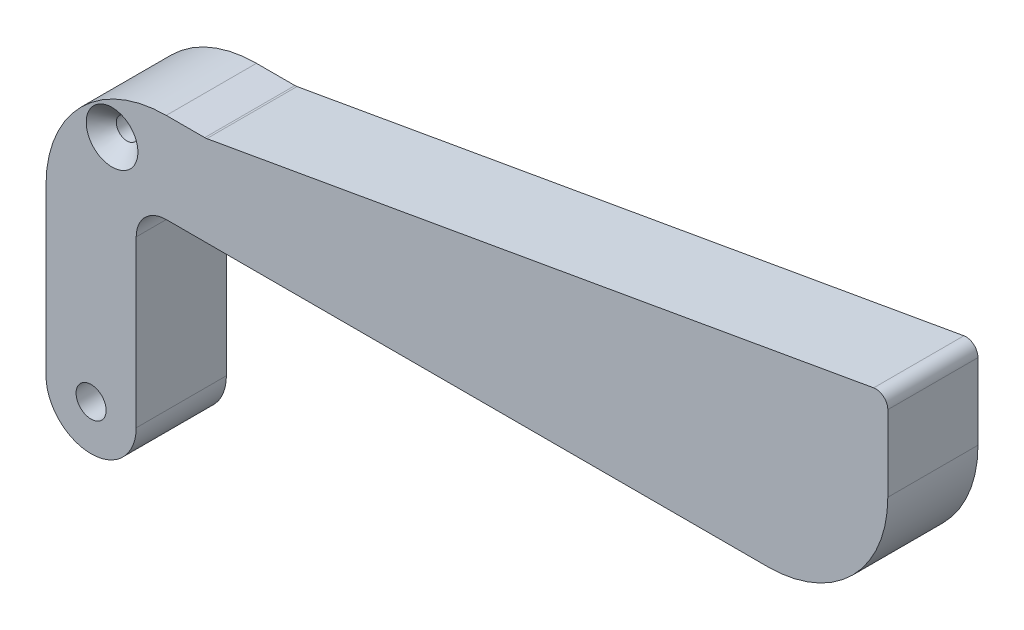
ISO-10303-21;
HEADER;
FILE_DESCRIPTION(('STEP AP214'),'2;1');
FILE_NAME('part.step','',(''),(''),'','','');
FILE_SCHEMA(('AUTOMOTIVE_DESIGN { 1 0 10303 214 1 1 1 1 }'));
ENDSEC;
DATA;
#1=APPLICATION_CONTEXT('core data for automotive mechanical design processes');
#2=APPLICATION_PROTOCOL_DEFINITION('international standard','automotive_design',2000,#1);
#3=PRODUCT_CONTEXT('',#1,'mechanical');
#4=PRODUCT('Part','Part','',(#3));
#5=PRODUCT_RELATED_PRODUCT_CATEGORY('part','',(#4));
#6=PRODUCT_DEFINITION_FORMATION('','',#4);
#7=PRODUCT_DEFINITION_CONTEXT('part definition',#1,'design');
#8=PRODUCT_DEFINITION('design','',#6,#7);
#9=PRODUCT_DEFINITION_SHAPE('','',#8);
#10=(LENGTH_UNIT() NAMED_UNIT(*) SI_UNIT(.MILLI.,.METRE.));
#11=(NAMED_UNIT(*) PLANE_ANGLE_UNIT() SI_UNIT($,.RADIAN.));
#12=(NAMED_UNIT(*) SI_UNIT($,.STERADIAN.) SOLID_ANGLE_UNIT());
#13=UNCERTAINTY_MEASURE_WITH_UNIT(LENGTH_MEASURE(1.E-05),#10,'distance_accuracy_value','');
#14=(GEOMETRIC_REPRESENTATION_CONTEXT(3) GLOBAL_UNCERTAINTY_ASSIGNED_CONTEXT((#13)) GLOBAL_UNIT_ASSIGNED_CONTEXT((#10,
#11,#12)) REPRESENTATION_CONTEXT('',''));
#15=CARTESIAN_POINT('',(0.,0.,0.));
#16=DIRECTION('',(0.,0.,1.));
#17=DIRECTION('',(1.,0.,0.));
#18=AXIS2_PLACEMENT_3D('',#15,#16,#17);
#19=CARTESIAN_POINT('',(0.,0.,19.05));
#20=DIRECTION('',(0.,1.,0.));
#21=DIRECTION('',(0.,0.,1.));
#22=AXIS2_PLACEMENT_3D('',#19,#20,#21);
#23=PLANE('',#22);
#24=DIRECTION('',(1.,0.,0.));
#25=VECTOR('',#24,1.);
#26=CARTESIAN_POINT('',(0.,0.,19.05));
#27=LINE('',#26,#25);
#28=CARTESIAN_POINT('',(25.4,0.,19.05));
#29=VERTEX_POINT('',#28);
#30=CARTESIAN_POINT('',(152.4,0.,19.05));
#31=VERTEX_POINT('',#30);
#32=EDGE_CURVE('E283',#29,#31,#27,.T.);
#33=ORIENTED_EDGE('',*,*,#32,.F.);
#34=DIRECTION('',(0.,0.,1.));
#35=VECTOR('',#34,1.);
#36=CARTESIAN_POINT('',(25.4,0.,0.));
#37=LINE('',#36,#35);
#38=CARTESIAN_POINT('',(25.4,0.,0.));
#39=VERTEX_POINT('',#38);
#40=EDGE_CURVE('E195',#29,#39,#37,.F.);
#41=ORIENTED_EDGE('',*,*,#40,.T.);
#42=DIRECTION('',(1.,0.,0.));
#43=VECTOR('',#42,1.);
#44=CARTESIAN_POINT('',(0.,0.,0.));
#45=LINE('',#44,#43);
#46=CARTESIAN_POINT('',(152.4,0.,0.));
#47=VERTEX_POINT('',#46);
#48=EDGE_CURVE('E157',#39,#47,#45,.T.);
#49=ORIENTED_EDGE('',*,*,#48,.T.);
#50=DIRECTION('',(0.,0.,-1.));
#51=VECTOR('',#50,1.);
#52=CARTESIAN_POINT('',(152.4,0.,19.05));
#53=LINE('',#52,#51);
#54=EDGE_CURVE('E178',#47,#31,#53,.F.);
#55=ORIENTED_EDGE('',*,*,#54,.T.);
#56=EDGE_LOOP('',(#33,#41,#49,#55));
#57=FACE_BOUND('',#56,.T.);
#58=ADVANCED_FACE('F33',(#57),#23,.F.);
#59=CARTESIAN_POINT('',(0.,0.,19.05));
#60=DIRECTION('',(1.,0.,0.));
#61=DIRECTION('',(0.,0.,-1.));
#62=AXIS2_PLACEMENT_3D('',#59,#60,#61);
#63=PLANE('',#62);
#64=DIRECTION('',(0.,-1.,0.));
#65=VECTOR('',#64,1.);
#66=CARTESIAN_POINT('',(0.,0.,0.));
#67=LINE('',#66,#65);
#68=CARTESIAN_POINT('',(0.,-6.34999999999999,0.));
#69=VERTEX_POINT('',#68);
#70=CARTESIAN_POINT('',(0.,-41.275,0.));
#71=VERTEX_POINT('',#70);
#72=EDGE_CURVE('E278',#69,#71,#67,.T.);
#73=ORIENTED_EDGE('',*,*,#72,.T.);
#74=DIRECTION('',(0.,0.,1.));
#75=VECTOR('',#74,1.);
#76=CARTESIAN_POINT('',(0.,-41.275,19.05));
#77=LINE('',#76,#75);
#78=CARTESIAN_POINT('',(0.,-41.275,19.05));
#79=VERTEX_POINT('',#78);
#80=EDGE_CURVE('E211',#71,#79,#77,.T.);
#81=ORIENTED_EDGE('',*,*,#80,.T.);
#82=DIRECTION('',(0.,-1.,0.));
#83=VECTOR('',#82,1.);
#84=CARTESIAN_POINT('',(0.,0.,19.05));
#85=LINE('',#84,#83);
#86=CARTESIAN_POINT('',(0.,-6.34999999999999,19.05));
#87=VERTEX_POINT('',#86);
#88=EDGE_CURVE('E155',#87,#79,#85,.T.);
#89=ORIENTED_EDGE('',*,*,#88,.F.);
#90=DIRECTION('',(0.,0.,-1.));
#91=VECTOR('',#90,1.);
#92=CARTESIAN_POINT('',(0.,-6.34999999999999,19.05));
#93=LINE('',#92,#91);
#94=EDGE_CURVE('E183',#87,#69,#93,.T.);
#95=ORIENTED_EDGE('',*,*,#94,.T.);
#96=EDGE_LOOP('',(#73,#81,#89,#95));
#97=FACE_BOUND('',#96,.T.);
#98=ADVANCED_FACE('F232',(#97),#63,.F.);
#99=CARTESIAN_POINT('',(177.8,0.,19.05));
#100=DIRECTION('',(-1.,0.,0.));
#101=DIRECTION('',(0.,0.,1.));
#102=AXIS2_PLACEMENT_3D('',#99,#100,#101);
#103=PLANE('',#102);
#104=DIRECTION('',(0.,1.,0.));
#105=VECTOR('',#104,1.);
#106=CARTESIAN_POINT('',(177.8,0.,19.05));
#107=LINE('',#106,#105);
#108=CARTESIAN_POINT('',(177.8,25.4,19.05));
#109=VERTEX_POINT('',#108);
#110=CARTESIAN_POINT('',(177.8,41.4229458748107,19.05));
#111=VERTEX_POINT('',#110);
#112=EDGE_CURVE('E285',#109,#111,#107,.T.);
#113=ORIENTED_EDGE('',*,*,#112,.F.);
#114=DIRECTION('',(0.,0.,-1.));
#115=VECTOR('',#114,1.);
#116=CARTESIAN_POINT('',(177.8,25.4,19.05));
#117=LINE('',#116,#115);
#118=CARTESIAN_POINT('',(177.8,25.4,0.));
#119=VERTEX_POINT('',#118);
#120=EDGE_CURVE('E172',#109,#119,#117,.T.);
#121=ORIENTED_EDGE('',*,*,#120,.T.);
#122=DIRECTION('',(0.,1.,0.));
#123=VECTOR('',#122,1.);
#124=CARTESIAN_POINT('',(177.8,0.,0.));
#125=LINE('',#124,#123);
#126=CARTESIAN_POINT('',(177.8,41.4229458748107,0.));
#127=VERTEX_POINT('',#126);
#128=EDGE_CURVE('E152',#119,#127,#125,.T.);
#129=ORIENTED_EDGE('',*,*,#128,.T.);
#130=DIRECTION('',(0.,0.,-1.));
#131=VECTOR('',#130,1.);
#132=CARTESIAN_POINT('',(177.8,41.4229458748107,19.05));
#133=LINE('',#132,#131);
#134=EDGE_CURVE('E134',#127,#111,#133,.F.);
#135=ORIENTED_EDGE('',*,*,#134,.T.);
#136=EDGE_LOOP('',(#113,#121,#129,#135));
#137=FACE_BOUND('',#136,.T.);
#138=ADVANCED_FACE('F238',(#137),#103,.F.);
#139=CARTESIAN_POINT('',(177.8,44.45,19.05));
#140=DIRECTION('',(0.173648177666931,-0.984807753012208,0.));
#141=DIRECTION('',(0.984807753012208,0.173648177666931,0.));
#142=AXIS2_PLACEMENT_3D('',#139,#140,#141);
#143=PLANE('',#142);
#144=DIRECTION('',(-0.984807753012208,-0.173648177666931,0.));
#145=VECTOR('',#144,1.);
#146=CARTESIAN_POINT('',(177.8,44.45,19.05));
#147=LINE('',#146,#145);
#148=CARTESIAN_POINT('',(174.818933628726,43.9243575674617,19.05));
#149=VERTEX_POINT('',#148);
#150=CARTESIAN_POINT('',(33.9682869476292,19.088588307349,19.05));
#151=VERTEX_POINT('',#150);
#152=EDGE_CURVE('E145',#149,#151,#147,.T.);
#153=ORIENTED_EDGE('',*,*,#152,.F.);
#154=DIRECTION('',(0.,0.,-1.));
#155=VECTOR('',#154,1.);
#156=CARTESIAN_POINT('',(174.818933628726,43.9243575674617,19.05));
#157=LINE('',#156,#155);
#158=CARTESIAN_POINT('',(174.818933628726,43.9243575674617,0.));
#159=VERTEX_POINT('',#158);
#160=EDGE_CURVE('E132',#149,#159,#157,.T.);
#161=ORIENTED_EDGE('',*,*,#160,.T.);
#162=DIRECTION('',(-0.984807753012208,-0.173648177666931,0.));
#163=VECTOR('',#162,1.);
#164=CARTESIAN_POINT('',(177.8,44.45,0.));
#165=LINE('',#164,#163);
#166=CARTESIAN_POINT('',(33.9682869476292,19.088588307349,0.));
#167=VERTEX_POINT('',#166);
#168=EDGE_CURVE('E142',#159,#167,#165,.T.);
#169=ORIENTED_EDGE('',*,*,#168,.T.);
#170=DIRECTION('',(0.,0.,-1.));
#171=VECTOR('',#170,1.);
#172=CARTESIAN_POINT('',(33.9682869476292,19.088588307349,19.05));
#173=LINE('',#172,#171);
#174=EDGE_CURVE('E146',#167,#151,#173,.F.);
#175=ORIENTED_EDGE('',*,*,#174,.T.);
#176=EDGE_LOOP('',(#153,#161,#169,#175));
#177=FACE_BOUND('',#176,.T.);
#178=ADVANCED_FACE('F141',(#177),#143,.F.);
#179=CARTESIAN_POINT('',(33.749441781711,19.05,19.05));
#180=DIRECTION('',(0.,-1.,0.));
#181=DIRECTION('',(1.,0.,0.));
#182=AXIS2_PLACEMENT_3D('',#179,#180,#181);
#183=PLANE('',#182);
#184=DIRECTION('',(-1.,0.,0.));
#185=VECTOR('',#184,1.);
#186=CARTESIAN_POINT('',(33.749441781711,19.05,0.));
#187=LINE('',#186,#185);
#188=CARTESIAN_POINT('',(33.5272205763552,19.05,0.));
#189=VERTEX_POINT('',#188);
#190=CARTESIAN_POINT('',(25.4,19.05,0.));
#191=VERTEX_POINT('',#190);
#192=EDGE_CURVE('E151',#189,#191,#187,.T.);
#193=ORIENTED_EDGE('',*,*,#192,.T.);
#194=DIRECTION('',(0.,0.,-1.));
#195=VECTOR('',#194,1.);
#196=CARTESIAN_POINT('',(25.4,19.05,19.05));
#197=LINE('',#196,#195);
#198=CARTESIAN_POINT('',(25.4,19.05,19.05));
#199=VERTEX_POINT('',#198);
#200=EDGE_CURVE('E188',#191,#199,#197,.F.);
#201=ORIENTED_EDGE('',*,*,#200,.T.);
#202=DIRECTION('',(-1.,0.,0.));
#203=VECTOR('',#202,1.);
#204=CARTESIAN_POINT('',(33.749441781711,19.05,19.05));
#205=LINE('',#204,#203);
#206=CARTESIAN_POINT('',(33.5272205763552,19.05,19.05));
#207=VERTEX_POINT('',#206);
#208=EDGE_CURVE('E161',#207,#199,#205,.T.);
#209=ORIENTED_EDGE('',*,*,#208,.F.);
#210=DIRECTION('',(0.,0.,-1.));
#211=VECTOR('',#210,1.);
#212=CARTESIAN_POINT('',(33.5272205763552,19.05,0.));
#213=LINE('',#212,#211);
#214=EDGE_CURVE('E166',#207,#189,#213,.T.);
#215=ORIENTED_EDGE('',*,*,#214,.T.);
#216=EDGE_LOOP('',(#193,#201,#209,#215));
#217=FACE_BOUND('',#216,.T.);
#218=ADVANCED_FACE('F307',(#217),#183,.F.);
#219=CARTESIAN_POINT('',(0.,0.,19.05));
#220=DIRECTION('',(0.,0.,1.));
#221=DIRECTION('',(1.,0.,0.));
#222=AXIS2_PLACEMENT_3D('',#219,#220,#221);
#223=PLANE('',#222);
#224=CARTESIAN_POINT('',(13.9525117315807,9.33169066306069,19.05));
#225=DIRECTION('',(0.,0.,1.));
#226=DIRECTION('',(1.,0.,0.));
#227=AXIS2_PLACEMENT_3D('',#224,#225,#226);
#228=CIRCLE('',#227,5.4610000000001);
#229=CARTESIAN_POINT('',(19.4135117315808,9.33169066306069,19.05));
#230=VERTEX_POINT('',#229);
#231=EDGE_CURVE('E11',#230,#230,#228,.F.);
#232=ORIENTED_EDGE('',*,*,#231,.T.);
#233=EDGE_LOOP('',(#232));
#234=FACE_BOUND('',#233,.T.);
#235=CARTESIAN_POINT('',(9.525,-41.275,19.05));
#236=DIRECTION('',(0.,0.,1.));
#237=DIRECTION('',(1.,0.,0.));
#238=AXIS2_PLACEMENT_3D('',#235,#236,#237);
#239=CIRCLE('',#238,3.175);
#240=CARTESIAN_POINT('',(12.7,-41.275,19.05));
#241=VERTEX_POINT('',#240);
#242=EDGE_CURVE('E215',#241,#241,#239,.T.);
#243=ORIENTED_EDGE('',*,*,#242,.F.);
#244=EDGE_LOOP('',(#243));
#245=FACE_BOUND('',#244,.T.);
#246=CARTESIAN_POINT('',(9.525,-41.275,19.05));
#247=DIRECTION('',(0.,0.,1.));
#248=DIRECTION('',(1.,0.,0.));
#249=AXIS2_PLACEMENT_3D('',#246,#247,#248);
#250=CIRCLE('',#249,9.525);
#251=CARTESIAN_POINT('',(9.525,-50.8,19.05));
#252=VERTEX_POINT('',#251);
#253=EDGE_CURVE('E202',#79,#252,#250,.T.);
#254=ORIENTED_EDGE('',*,*,#253,.T.);
#255=CARTESIAN_POINT('',(9.52500000000001,-41.275,19.05));
#256=DIRECTION('',(0.,0.,1.));
#257=DIRECTION('',(1.,0.,0.));
#258=AXIS2_PLACEMENT_3D('',#255,#256,#257);
#259=CIRCLE('',#258,9.525);
#260=CARTESIAN_POINT('',(19.05,-41.275,19.05));
#261=VERTEX_POINT('',#260);
#262=EDGE_CURVE('E204',#252,#261,#259,.T.);
#263=ORIENTED_EDGE('',*,*,#262,.T.);
#264=DIRECTION('',(0.,-1.,0.));
#265=VECTOR('',#264,1.);
#266=CARTESIAN_POINT('',(19.05,0.,19.05));
#267=LINE('',#266,#265);
#268=CARTESIAN_POINT('',(19.05,-6.35,19.05));
#269=VERTEX_POINT('',#268);
#270=EDGE_CURVE('E288',#269,#261,#267,.T.);
#271=ORIENTED_EDGE('',*,*,#270,.F.);
#272=CARTESIAN_POINT('',(25.4,-6.35,19.05));
#273=DIRECTION('',(0.,0.,1.));
#274=DIRECTION('',(1.,0.,0.));
#275=AXIS2_PLACEMENT_3D('',#272,#273,#274);
#276=CIRCLE('',#275,6.35);
#277=EDGE_CURVE('E197',#269,#29,#276,.F.);
#278=ORIENTED_EDGE('',*,*,#277,.T.);
#279=ORIENTED_EDGE('',*,*,#32,.T.);
#280=CARTESIAN_POINT('',(152.4,25.4,19.05));
#281=DIRECTION('',(0.,0.,1.));
#282=DIRECTION('',(1.,0.,0.));
#283=AXIS2_PLACEMENT_3D('',#280,#281,#282);
#284=CIRCLE('',#283,25.4);
#285=EDGE_CURVE('E181',#31,#109,#284,.T.);
#286=ORIENTED_EDGE('',*,*,#285,.T.);
#287=ORIENTED_EDGE('',*,*,#112,.T.);
#288=CARTESIAN_POINT('',(175.26,41.4229458748107,19.05));
#289=DIRECTION('',(0.,0.,1.));
#290=DIRECTION('',(1.,0.,0.));
#291=AXIS2_PLACEMENT_3D('',#288,#289,#290);
#292=CIRCLE('',#291,2.54);
#293=EDGE_CURVE('E164',#111,#149,#292,.T.);
#294=ORIENTED_EDGE('',*,*,#293,.T.);
#295=ORIENTED_EDGE('',*,*,#152,.T.);
#296=CARTESIAN_POINT('',(33.5272205763552,21.59,19.05));
#297=DIRECTION('',(0.,0.,1.));
#298=DIRECTION('',(1.,0.,0.));
#299=AXIS2_PLACEMENT_3D('',#296,#297,#298);
#300=CIRCLE('',#299,2.54);
#301=EDGE_CURVE('E170',#151,#207,#300,.F.);
#302=ORIENTED_EDGE('',*,*,#301,.T.);
#303=ORIENTED_EDGE('',*,*,#208,.T.);
#304=CARTESIAN_POINT('',(25.4,-6.34999999999999,19.05));
#305=DIRECTION('',(0.,0.,1.));
#306=DIRECTION('',(1.,0.,0.));
#307=AXIS2_PLACEMENT_3D('',#304,#305,#306);
#308=CIRCLE('',#307,25.4);
#309=EDGE_CURVE('E190',#199,#87,#308,.T.);
#310=ORIENTED_EDGE('',*,*,#309,.T.);
#311=ORIENTED_EDGE('',*,*,#88,.T.);
#312=EDGE_LOOP('',(#254,#263,#271,#278,#279,#286,#287,#294,#295,#302,#303,#310,#311));
#313=FACE_BOUND('',#312,.T.);
#314=ADVANCED_FACE('F280',(#234,#245,#313),#223,.T.);
#315=CARTESIAN_POINT('',(0.,0.,0.));
#316=DIRECTION('',(0.,0.,1.));
#317=DIRECTION('',(1.,0.,0.));
#318=AXIS2_PLACEMENT_3D('',#315,#316,#317);
#319=PLANE('',#318);
#320=CARTESIAN_POINT('',(13.9525117315807,9.33169066306069,0.));
#321=DIRECTION('',(0.,0.,1.));
#322=DIRECTION('',(1.,0.,0.));
#323=AXIS2_PLACEMENT_3D('',#320,#321,#322);
#324=CIRCLE('',#323,2.286);
#325=CARTESIAN_POINT('',(16.2385117315807,9.33169066306069,0.));
#326=VERTEX_POINT('',#325);
#327=EDGE_CURVE('E216',#326,#326,#324,.T.);
#328=ORIENTED_EDGE('',*,*,#327,.T.);
#329=EDGE_LOOP('',(#328));
#330=FACE_BOUND('',#329,.T.);
#331=CARTESIAN_POINT('',(9.525,-41.275,0.));
#332=DIRECTION('',(0.,0.,1.));
#333=DIRECTION('',(1.,0.,0.));
#334=AXIS2_PLACEMENT_3D('',#331,#332,#333);
#335=CIRCLE('',#334,3.175);
#336=CARTESIAN_POINT('',(12.7,-41.275,0.));
#337=VERTEX_POINT('',#336);
#338=EDGE_CURVE('E331',#337,#337,#335,.T.);
#339=ORIENTED_EDGE('',*,*,#338,.T.);
#340=EDGE_LOOP('',(#339));
#341=FACE_BOUND('',#340,.T.);
#342=DIRECTION('',(0.,1.,0.));
#343=VECTOR('',#342,1.);
#344=CARTESIAN_POINT('',(19.05,0.,0.));
#345=LINE('',#344,#343);
#346=CARTESIAN_POINT('',(19.05,-41.275,0.));
#347=VERTEX_POINT('',#346);
#348=CARTESIAN_POINT('',(19.05,-6.35,0.));
#349=VERTEX_POINT('',#348);
#350=EDGE_CURVE('E294',#347,#349,#345,.T.);
#351=ORIENTED_EDGE('',*,*,#350,.F.);
#352=CARTESIAN_POINT('',(9.52500000000001,-41.275,0.));
#353=DIRECTION('',(0.,0.,1.));
#354=DIRECTION('',(1.,0.,0.));
#355=AXIS2_PLACEMENT_3D('',#352,#353,#354);
#356=CIRCLE('',#355,9.525);
#357=CARTESIAN_POINT('',(9.525,-50.8,0.));
#358=VERTEX_POINT('',#357);
#359=EDGE_CURVE('E48',#347,#358,#356,.F.);
#360=ORIENTED_EDGE('',*,*,#359,.T.);
#361=CARTESIAN_POINT('',(9.525,-41.275,0.));
#362=DIRECTION('',(0.,0.,1.));
#363=DIRECTION('',(1.,0.,0.));
#364=AXIS2_PLACEMENT_3D('',#361,#362,#363);
#365=CIRCLE('',#364,9.525);
#366=EDGE_CURVE('E52',#358,#71,#365,.F.);
#367=ORIENTED_EDGE('',*,*,#366,.T.);
#368=ORIENTED_EDGE('',*,*,#72,.F.);
#369=CARTESIAN_POINT('',(25.4,-6.34999999999999,0.));
#370=DIRECTION('',(0.,0.,1.));
#371=DIRECTION('',(1.,0.,0.));
#372=AXIS2_PLACEMENT_3D('',#369,#370,#371);
#373=CIRCLE('',#372,25.4);
#374=EDGE_CURVE('E186',#69,#191,#373,.F.);
#375=ORIENTED_EDGE('',*,*,#374,.T.);
#376=ORIENTED_EDGE('',*,*,#192,.F.);
#377=CARTESIAN_POINT('',(33.5272205763552,21.59,0.));
#378=DIRECTION('',(0.,0.,1.));
#379=DIRECTION('',(1.,0.,0.));
#380=AXIS2_PLACEMENT_3D('',#377,#378,#379);
#381=CIRCLE('',#380,2.54);
#382=EDGE_CURVE('E150',#189,#167,#381,.T.);
#383=ORIENTED_EDGE('',*,*,#382,.T.);
#384=ORIENTED_EDGE('',*,*,#168,.F.);
#385=CARTESIAN_POINT('',(175.26,41.4229458748107,0.));
#386=DIRECTION('',(0.,0.,1.));
#387=DIRECTION('',(1.,0.,0.));
#388=AXIS2_PLACEMENT_3D('',#385,#386,#387);
#389=CIRCLE('',#388,2.54);
#390=EDGE_CURVE('E128',#159,#127,#389,.F.);
#391=ORIENTED_EDGE('',*,*,#390,.T.);
#392=ORIENTED_EDGE('',*,*,#128,.F.);
#393=CARTESIAN_POINT('',(152.4,25.4,0.));
#394=DIRECTION('',(0.,0.,1.));
#395=DIRECTION('',(1.,0.,0.));
#396=AXIS2_PLACEMENT_3D('',#393,#394,#395);
#397=CIRCLE('',#396,25.4);
#398=EDGE_CURVE('E175',#119,#47,#397,.F.);
#399=ORIENTED_EDGE('',*,*,#398,.T.);
#400=ORIENTED_EDGE('',*,*,#48,.F.);
#401=CARTESIAN_POINT('',(25.4,-6.35,0.));
#402=DIRECTION('',(0.,0.,1.));
#403=DIRECTION('',(1.,0.,0.));
#404=AXIS2_PLACEMENT_3D('',#401,#402,#403);
#405=CIRCLE('',#404,6.35);
#406=EDGE_CURVE('E199',#39,#349,#405,.T.);
#407=ORIENTED_EDGE('',*,*,#406,.T.);
#408=EDGE_LOOP('',(#351,#360,#367,#368,#375,#376,#383,#384,#391,#392,#399,#400,#407));
#409=FACE_BOUND('',#408,.T.);
#410=ADVANCED_FACE('F148',(#330,#341,#409),#319,.F.);
#411=CARTESIAN_POINT('',(19.05,0.,-54.2544237827663));
#412=DIRECTION('',(-1.,0.,0.));
#413=DIRECTION('',(0.,-1.,0.));
#414=AXIS2_PLACEMENT_3D('',#411,#412,#413);
#415=PLANE('',#414);
#416=ORIENTED_EDGE('',*,*,#270,.T.);
#417=DIRECTION('',(0.,0.,1.));
#418=VECTOR('',#417,1.);
#419=CARTESIAN_POINT('',(19.05,-41.275,0.));
#420=LINE('',#419,#418);
#421=EDGE_CURVE('E206',#261,#347,#420,.F.);
#422=ORIENTED_EDGE('',*,*,#421,.T.);
#423=ORIENTED_EDGE('',*,*,#350,.T.);
#424=DIRECTION('',(0.,0.,1.));
#425=VECTOR('',#424,1.);
#426=CARTESIAN_POINT('',(19.05,-6.35,19.05));
#427=LINE('',#426,#425);
#428=EDGE_CURVE('E192',#349,#269,#427,.T.);
#429=ORIENTED_EDGE('',*,*,#428,.T.);
#430=EDGE_LOOP('',(#416,#422,#423,#429));
#431=FACE_BOUND('',#430,.T.);
#432=ADVANCED_FACE('F248',(#431),#415,.F.);
#433=CARTESIAN_POINT('',(175.26,41.4229458748107,19.05));
#434=DIRECTION('',(0.,0.,-1.));
#435=DIRECTION('',(-1.,0.,0.));
#436=AXIS2_PLACEMENT_3D('',#433,#434,#435);
#437=CYLINDRICAL_SURFACE('',#436,2.54);
#438=ORIENTED_EDGE('',*,*,#293,.F.);
#439=ORIENTED_EDGE('',*,*,#134,.F.);
#440=ORIENTED_EDGE('',*,*,#390,.F.);
#441=ORIENTED_EDGE('',*,*,#160,.F.);
#442=EDGE_LOOP('',(#438,#439,#440,#441));
#443=FACE_BOUND('',#442,.T.);
#444=ADVANCED_FACE('F131',(#443),#437,.T.);
#445=CARTESIAN_POINT('',(33.5272205763552,21.59,19.05));
#446=DIRECTION('',(0.,0.,1.));
#447=DIRECTION('',(1.,0.,0.));
#448=AXIS2_PLACEMENT_3D('',#445,#446,#447);
#449=CYLINDRICAL_SURFACE('',#448,2.54);
#450=ORIENTED_EDGE('',*,*,#301,.F.);
#451=ORIENTED_EDGE('',*,*,#174,.F.);
#452=ORIENTED_EDGE('',*,*,#382,.F.);
#453=ORIENTED_EDGE('',*,*,#214,.F.);
#454=EDGE_LOOP('',(#450,#451,#452,#453));
#455=FACE_BOUND('',#454,.T.);
#456=ADVANCED_FACE('F247',(#455),#449,.F.);
#457=CARTESIAN_POINT('',(9.525,-41.275,0.));
#458=DIRECTION('',(0.,0.,1.));
#459=DIRECTION('',(1.,0.,0.));
#460=AXIS2_PLACEMENT_3D('',#457,#458,#459);
#461=CYLINDRICAL_SURFACE('',#460,3.175);
#462=CARTESIAN_POINT('',(12.7,-41.275,0.));
#463=CARTESIAN_POINT('',(12.7,-41.275,0.1984375));
#464=CARTESIAN_POINT('',(12.7,-41.275,0.396875));
#465=CARTESIAN_POINT('',(12.7,-41.275,0.79375));
#466=CARTESIAN_POINT('',(12.7,-41.275,0.9921875));
#467=CARTESIAN_POINT('',(12.7,-41.275,1.3890625));
#468=CARTESIAN_POINT('',(12.7,-41.275,1.5875));
#469=CARTESIAN_POINT('',(12.7,-41.275,1.984375));
#470=CARTESIAN_POINT('',(12.7,-41.275,2.1828125));
#471=CARTESIAN_POINT('',(12.7,-41.275,2.5796875));
#472=CARTESIAN_POINT('',(12.7,-41.275,2.778125));
#473=CARTESIAN_POINT('',(12.7,-41.275,3.175));
#474=CARTESIAN_POINT('',(12.7,-41.275,3.3734375));
#475=CARTESIAN_POINT('',(12.7,-41.275,3.7703125));
#476=CARTESIAN_POINT('',(12.7,-41.275,3.96875));
#477=CARTESIAN_POINT('',(12.7,-41.275,4.365625));
#478=CARTESIAN_POINT('',(12.7,-41.275,4.5640625));
#479=CARTESIAN_POINT('',(12.7,-41.275,4.9609375));
#480=CARTESIAN_POINT('',(12.7,-41.275,5.159375));
#481=CARTESIAN_POINT('',(12.7,-41.275,5.55625));
#482=CARTESIAN_POINT('',(12.7,-41.275,5.7546875));
#483=CARTESIAN_POINT('',(12.7,-41.275,6.1515625));
#484=CARTESIAN_POINT('',(12.7,-41.275,6.35));
#485=CARTESIAN_POINT('',(12.7,-41.275,6.746875));
#486=CARTESIAN_POINT('',(12.7,-41.275,6.9453125));
#487=CARTESIAN_POINT('',(12.7,-41.275,7.3421875));
#488=CARTESIAN_POINT('',(12.7,-41.275,7.540625));
#489=CARTESIAN_POINT('',(12.7,-41.275,7.9375));
#490=CARTESIAN_POINT('',(12.7,-41.275,8.1359375));
#491=CARTESIAN_POINT('',(12.7,-41.275,8.5328125));
#492=CARTESIAN_POINT('',(12.7,-41.275,8.73125));
#493=CARTESIAN_POINT('',(12.7,-41.275,9.128125));
#494=CARTESIAN_POINT('',(12.7,-41.275,9.3265625));
#495=CARTESIAN_POINT('',(12.7,-41.275,9.7234375));
#496=CARTESIAN_POINT('',(12.7,-41.275,9.921875));
#497=CARTESIAN_POINT('',(12.7,-41.275,10.31875));
#498=CARTESIAN_POINT('',(12.7,-41.275,10.5171875));
#499=CARTESIAN_POINT('',(12.7,-41.275,10.9140625));
#500=CARTESIAN_POINT('',(12.7,-41.275,11.1125));
#501=CARTESIAN_POINT('',(12.7,-41.275,11.509375));
#502=CARTESIAN_POINT('',(12.7,-41.275,11.7078125));
#503=CARTESIAN_POINT('',(12.7,-41.275,12.1046875));
#504=CARTESIAN_POINT('',(12.7,-41.275,12.303125));
#505=CARTESIAN_POINT('',(12.7,-41.275,12.7));
#506=CARTESIAN_POINT('',(12.7,-41.275,12.8984375));
#507=CARTESIAN_POINT('',(12.7,-41.275,13.2953125));
#508=CARTESIAN_POINT('',(12.7,-41.275,13.49375));
#509=CARTESIAN_POINT('',(12.7,-41.275,13.890625));
#510=CARTESIAN_POINT('',(12.7,-41.275,14.0890625));
#511=CARTESIAN_POINT('',(12.7,-41.275,14.4859375));
#512=CARTESIAN_POINT('',(12.7,-41.275,14.684375));
#513=CARTESIAN_POINT('',(12.7,-41.275,15.08125));
#514=CARTESIAN_POINT('',(12.7,-41.275,15.2796875));
#515=CARTESIAN_POINT('',(12.7,-41.275,15.6765625));
#516=CARTESIAN_POINT('',(12.7,-41.275,15.875));
#517=CARTESIAN_POINT('',(12.7,-41.275,16.271875));
#518=CARTESIAN_POINT('',(12.7,-41.275,16.4703125));
#519=CARTESIAN_POINT('',(12.7,-41.275,16.8671875));
#520=CARTESIAN_POINT('',(12.7,-41.275,17.065625));
#521=CARTESIAN_POINT('',(12.7,-41.275,17.4625));
#522=CARTESIAN_POINT('',(12.7,-41.275,17.6609375));
#523=CARTESIAN_POINT('',(12.7,-41.275,18.0578125));
#524=CARTESIAN_POINT('',(12.7,-41.275,18.25625));
#525=CARTESIAN_POINT('',(12.7,-41.275,18.653125));
#526=CARTESIAN_POINT('',(12.7,-41.275,18.8515625));
#527=CARTESIAN_POINT('',(12.7,-41.275,19.05));
#528=B_SPLINE_CURVE_WITH_KNOTS('',3,(#462,#463,#464,#465,#466,#467,#468,#469,#470,#471,#472,
#473,#474,#475,#476,#477,#478,#479,#480,#481,#482,#483,#484,#485,#486,#487,#488,#489,#490,#491,
#492,#493,#494,#495,#496,#497,#498,#499,#500,#501,#502,#503,#504,#505,#506,#507,#508,#509,#510,
#511,#512,#513,#514,#515,#516,#517,#518,#519,#520,#521,#522,#523,#524,#525,#526,#527),
.UNSPECIFIED.,.F.,.F.,(4,2,2,2,2,2,2,2,2,2,2,2,2,2,2,2,2,2,2,2,2,2,2,2,2,2,2,2,2,2,2,2,4),(0.,
0.5953125,1.190625,1.7859375,2.38125,2.9765625,3.571875,4.1671875,4.7625,5.3578125,5.953125,
6.5484375,7.14375,7.7390625,8.334375,8.9296875,9.525,10.1203125,10.715625,11.3109375,11.90625,
12.5015625,13.096875,13.6921875,14.2875,14.8828125,15.478125,16.0734375,16.66875,17.2640625,
17.859375,18.4546875,19.05),.UNSPECIFIED.);
#529=EDGE_CURVE('BSEAM251',#337,#241,#528,.T.);
#530=ORIENTED_EDGE('',*,*,#338,.F.);
#531=ORIENTED_EDGE('',*,*,#242,.T.);
#532=ORIENTED_EDGE('',*,*,#529,.T.);
#533=ORIENTED_EDGE('',*,*,#529,.F.);
#534=EDGE_LOOP('',(#530,#532,#531,#533));
#535=FACE_BOUND('',#534,.T.);
#536=ADVANCED_FACE('F251',(#535),#461,.F.);
#537=CARTESIAN_POINT('',(152.4,25.4,19.05));
#538=DIRECTION('',(0.,0.,-1.));
#539=DIRECTION('',(-1.,0.,0.));
#540=AXIS2_PLACEMENT_3D('',#537,#538,#539);
#541=CYLINDRICAL_SURFACE('',#540,25.4);
#542=ORIENTED_EDGE('',*,*,#285,.F.);
#543=ORIENTED_EDGE('',*,*,#54,.F.);
#544=ORIENTED_EDGE('',*,*,#398,.F.);
#545=ORIENTED_EDGE('',*,*,#120,.F.);
#546=EDGE_LOOP('',(#542,#543,#544,#545));
#547=FACE_BOUND('',#546,.T.);
#548=ADVANCED_FACE('F253',(#547),#541,.T.);
#549=CARTESIAN_POINT('',(25.4,-6.34999999999999,19.05));
#550=DIRECTION('',(0.,0.,-1.));
#551=DIRECTION('',(-1.,0.,0.));
#552=AXIS2_PLACEMENT_3D('',#549,#550,#551);
#553=CYLINDRICAL_SURFACE('',#552,25.4);
#554=ORIENTED_EDGE('',*,*,#309,.F.);
#555=ORIENTED_EDGE('',*,*,#200,.F.);
#556=ORIENTED_EDGE('',*,*,#374,.F.);
#557=ORIENTED_EDGE('',*,*,#94,.F.);
#558=EDGE_LOOP('',(#554,#555,#556,#557));
#559=FACE_BOUND('',#558,.T.);
#560=ADVANCED_FACE('F256',(#559),#553,.T.);
#561=CARTESIAN_POINT('',(25.4,-6.35,-54.2544237827663));
#562=DIRECTION('',(0.,0.,-1.));
#563=DIRECTION('',(-1.,0.,0.));
#564=AXIS2_PLACEMENT_3D('',#561,#562,#563);
#565=CYLINDRICAL_SURFACE('',#564,6.35);
#566=ORIENTED_EDGE('',*,*,#406,.F.);
#567=ORIENTED_EDGE('',*,*,#40,.F.);
#568=ORIENTED_EDGE('',*,*,#277,.F.);
#569=ORIENTED_EDGE('',*,*,#428,.F.);
#570=EDGE_LOOP('',(#566,#567,#568,#569));
#571=FACE_BOUND('',#570,.T.);
#572=ADVANCED_FACE('F260',(#571),#565,.F.);
#573=CARTESIAN_POINT('',(9.525,-41.275,19.05));
#574=DIRECTION('',(0.,0.,-1.));
#575=DIRECTION('',(-1.,0.,0.));
#576=AXIS2_PLACEMENT_3D('',#573,#574,#575);
#577=CYLINDRICAL_SURFACE('',#576,9.525);
#578=ORIENTED_EDGE('',*,*,#80,.F.);
#579=ORIENTED_EDGE('',*,*,#366,.F.);
#580=DIRECTION('',(0.,0.,1.));
#581=VECTOR('',#580,1.);
#582=CARTESIAN_POINT('',(9.525,-50.8,0.));
#583=LINE('',#582,#581);
#584=EDGE_CURVE('E213',#252,#358,#583,.F.);
#585=ORIENTED_EDGE('',*,*,#584,.F.);
#586=ORIENTED_EDGE('',*,*,#253,.F.);
#587=EDGE_LOOP('',(#578,#579,#585,#586));
#588=FACE_BOUND('',#587,.T.);
#589=ADVANCED_FACE('F264',(#588),#577,.T.);
#590=CARTESIAN_POINT('',(9.52500000000001,-41.275,-54.2544237827663));
#591=DIRECTION('',(0.,0.,-1.));
#592=DIRECTION('',(-1.,0.,0.));
#593=AXIS2_PLACEMENT_3D('',#590,#591,#592);
#594=CYLINDRICAL_SURFACE('',#593,9.525);
#595=ORIENTED_EDGE('',*,*,#359,.F.);
#596=ORIENTED_EDGE('',*,*,#421,.F.);
#597=ORIENTED_EDGE('',*,*,#262,.F.);
#598=ORIENTED_EDGE('',*,*,#584,.T.);
#599=EDGE_LOOP('',(#595,#596,#597,#598));
#600=FACE_BOUND('',#599,.T.);
#601=ADVANCED_FACE('F228',(#600),#594,.T.);
#602=CARTESIAN_POINT('',(13.9525117315807,9.33169066306069,0.));
#603=DIRECTION('',(0.,0.,1.));
#604=DIRECTION('',(1.,0.,0.));
#605=AXIS2_PLACEMENT_3D('',#602,#603,#604);
#606=CYLINDRICAL_SURFACE('',#605,2.286);
#607=CARTESIAN_POINT('',(13.9525117315807,9.33169066306069,15.8749999999999));
#608=DIRECTION('',(0.,0.,1.));
#609=DIRECTION('',(1.,0.,0.));
#610=AXIS2_PLACEMENT_3D('',#607,#608,#609);
#611=CIRCLE('',#610,2.286);
#612=CARTESIAN_POINT('',(16.2385117315807,9.33169066306069,15.8749999999999));
#613=VERTEX_POINT('',#612);
#614=EDGE_CURVE('E41',#613,#613,#611,.T.);
#615=CARTESIAN_POINT('',(16.2385117315807,9.33169066306069,15.8749999999999));
#616=CARTESIAN_POINT('',(16.2385117315807,9.33169066306069,15.7096354166666));
#617=CARTESIAN_POINT('',(16.2385117315807,9.33169066306069,15.5442708333333));
#618=CARTESIAN_POINT('',(16.2385117315807,9.33169066306069,15.2135416666666));
#619=CARTESIAN_POINT('',(16.2385117315807,9.33169066306069,15.0481770833333));
#620=CARTESIAN_POINT('',(16.2385117315807,9.33169066306069,14.7174479166666));
#621=CARTESIAN_POINT('',(16.2385117315807,9.33169066306069,14.5520833333333));
#622=CARTESIAN_POINT('',(16.2385117315807,9.33169066306069,14.2213541666666));
#623=CARTESIAN_POINT('',(16.2385117315807,9.33169066306069,14.0559895833333));
#624=CARTESIAN_POINT('',(16.2385117315807,9.33169066306069,13.7252604166666));
#625=CARTESIAN_POINT('',(16.2385117315807,9.33169066306069,13.5598958333333));
#626=CARTESIAN_POINT('',(16.2385117315807,9.33169066306069,13.2291666666666));
#627=CARTESIAN_POINT('',(16.2385117315807,9.33169066306069,13.0638020833333));
#628=CARTESIAN_POINT('',(16.2385117315807,9.33169066306069,12.7330729166666));
#629=CARTESIAN_POINT('',(16.2385117315807,9.33169066306069,12.5677083333333));
#630=CARTESIAN_POINT('',(16.2385117315807,9.33169066306069,12.2369791666666));
#631=CARTESIAN_POINT('',(16.2385117315807,9.33169066306069,12.0716145833333));
#632=CARTESIAN_POINT('',(16.2385117315807,9.33169066306069,11.7408854166666));
#633=CARTESIAN_POINT('',(16.2385117315807,9.33169066306069,11.5755208333333));
#634=CARTESIAN_POINT('',(16.2385117315807,9.33169066306069,11.2447916666666));
#635=CARTESIAN_POINT('',(16.2385117315807,9.33169066306069,11.0794270833333));
#636=CARTESIAN_POINT('',(16.2385117315807,9.33169066306069,10.7486979166666));
#637=CARTESIAN_POINT('',(16.2385117315807,9.33169066306069,10.5833333333333));
#638=CARTESIAN_POINT('',(16.2385117315807,9.33169066306069,10.2526041666666));
#639=CARTESIAN_POINT('',(16.2385117315807,9.33169066306069,10.0872395833333));
#640=CARTESIAN_POINT('',(16.2385117315807,9.33169066306069,9.75651041666662));
#641=CARTESIAN_POINT('',(16.2385117315807,9.33169066306069,9.59114583333329));
#642=CARTESIAN_POINT('',(16.2385117315807,9.33169066306069,9.26041666666662));
#643=CARTESIAN_POINT('',(16.2385117315807,9.33169066306069,9.09505208333329));
#644=CARTESIAN_POINT('',(16.2385117315807,9.33169066306069,8.76432291666662));
#645=CARTESIAN_POINT('',(16.2385117315807,9.33169066306069,8.59895833333329));
#646=CARTESIAN_POINT('',(16.2385117315807,9.33169066306069,8.26822916666663));
#647=CARTESIAN_POINT('',(16.2385117315807,9.33169066306069,8.10286458333329));
#648=CARTESIAN_POINT('',(16.2385117315807,9.33169066306069,7.77213541666663));
#649=CARTESIAN_POINT('',(16.2385117315807,9.33169066306069,7.6067708333333));
#650=CARTESIAN_POINT('',(16.2385117315807,9.33169066306069,7.27604166666663));
#651=CARTESIAN_POINT('',(16.2385117315807,9.33169066306069,7.1106770833333));
#652=CARTESIAN_POINT('',(16.2385117315807,9.33169066306069,6.77994791666663));
#653=CARTESIAN_POINT('',(16.2385117315807,9.33169066306069,6.6145833333333));
#654=CARTESIAN_POINT('',(16.2385117315807,9.33169066306069,6.28385416666664));
#655=CARTESIAN_POINT('',(16.2385117315807,9.33169066306069,6.1184895833333));
#656=CARTESIAN_POINT('',(16.2385117315807,9.33169066306069,5.78776041666664));
#657=CARTESIAN_POINT('',(16.2385117315807,9.33169066306069,5.62239583333331));
#658=CARTESIAN_POINT('',(16.2385117315807,9.33169066306069,5.29166666666664));
#659=CARTESIAN_POINT('',(16.2385117315807,9.33169066306069,5.12630208333331));
#660=CARTESIAN_POINT('',(16.2385117315807,9.33169066306069,4.79557291666664));
#661=CARTESIAN_POINT('',(16.2385117315807,9.33169066306069,4.63020833333331));
#662=CARTESIAN_POINT('',(16.2385117315807,9.33169066306069,4.29947916666664));
#663=CARTESIAN_POINT('',(16.2385117315807,9.33169066306069,4.13411458333331));
#664=CARTESIAN_POINT('',(16.2385117315807,9.33169066306069,3.80338541666665));
#665=CARTESIAN_POINT('',(16.2385117315807,9.33169066306069,3.63802083333332));
#666=CARTESIAN_POINT('',(16.2385117315807,9.33169066306069,3.30729166666665));
#667=CARTESIAN_POINT('',(16.2385117315807,9.33169066306069,3.14192708333332));
#668=CARTESIAN_POINT('',(16.2385117315807,9.33169066306069,2.81119791666665));
#669=CARTESIAN_POINT('',(16.2385117315807,9.33169066306069,2.64583333333332));
#670=CARTESIAN_POINT('',(16.2385117315807,9.33169066306069,2.31510416666666));
#671=CARTESIAN_POINT('',(16.2385117315807,9.33169066306069,2.14973958333332));
#672=CARTESIAN_POINT('',(16.2385117315807,9.33169066306069,1.81901041666666));
#673=CARTESIAN_POINT('',(16.2385117315807,9.33169066306069,1.65364583333332));
#674=CARTESIAN_POINT('',(16.2385117315807,9.33169066306069,1.32291666666666));
#675=CARTESIAN_POINT('',(16.2385117315807,9.33169066306069,1.15755208333333));
#676=CARTESIAN_POINT('',(16.2385117315807,9.33169066306069,0.826822916666662));
#677=CARTESIAN_POINT('',(16.2385117315807,9.33169066306069,0.66145833333333));
#678=CARTESIAN_POINT('',(16.2385117315807,9.33169066306069,0.330729166666665));
#679=CARTESIAN_POINT('',(16.2385117315807,9.33169066306069,0.165364583333333));
#680=CARTESIAN_POINT('',(16.2385117315807,9.33169066306069,0.));
#681=B_SPLINE_CURVE_WITH_KNOTS('',3,(#615,#616,#617,#618,#619,#620,#621,#622,#623,#624,#625,
#626,#627,#628,#629,#630,#631,#632,#633,#634,#635,#636,#637,#638,#639,#640,#641,#642,#643,#644,
#645,#646,#647,#648,#649,#650,#651,#652,#653,#654,#655,#656,#657,#658,#659,#660,#661,#662,#663,
#664,#665,#666,#667,#668,#669,#670,#671,#672,#673,#674,#675,#676,#677,#678,#679,#680),
.UNSPECIFIED.,.F.,.F.,(4,2,2,2,2,2,2,2,2,2,2,2,2,2,2,2,2,2,2,2,2,2,2,2,2,2,2,2,2,2,2,2,4),(0.,
0.496093749999996,0.992187499999993,1.48828124999999,1.98437499999999,2.48046874999999,
2.97656249999998,3.47265624999998,3.96874999999998,4.46484374999998,4.96093749999997,
5.45703124999997,5.95312499999997,6.44921874999997,6.94531249999997,7.44140624999996,
7.93749999999996,8.43359374999996,8.92968749999996,9.42578124999995,9.92187499999995,
10.4179687499999,10.9140624999999,11.4101562499999,11.9062499999999,12.4023437499999,
12.8984374999999,13.3945312499999,13.8906249999999,14.3867187499999,14.8828124999999,
15.3789062499999,15.8749999999999),.UNSPECIFIED.);
#682=EDGE_CURVE('BSEAM220',#613,#326,#681,.T.);
#683=ORIENTED_EDGE('',*,*,#614,.T.);
#684=ORIENTED_EDGE('',*,*,#327,.F.);
#685=ORIENTED_EDGE('',*,*,#682,.T.);
#686=ORIENTED_EDGE('',*,*,#682,.F.);
#687=EDGE_LOOP('',(#683,#685,#684,#686));
#688=FACE_BOUND('',#687,.T.);
#689=ADVANCED_FACE('F220',(#688),#606,.F.);
#690=CARTESIAN_POINT('',(13.9525117315807,9.33169066306069,15.8749999999999));
#691=DIRECTION('',(0.,0.,1.));
#692=DIRECTION('',(1.,0.,0.));
#693=AXIS2_PLACEMENT_3D('',#690,#691,#692);
#694=CONICAL_SURFACE('',#693,2.286,0.785398163397453);
#695=CARTESIAN_POINT('',(19.4135117315808,9.33169066306069,19.05));
#696=CARTESIAN_POINT('',(19.3804388149141,9.33169066306069,19.0169270833333));
#697=CARTESIAN_POINT('',(19.3473658982475,9.33169066306069,18.9838541666667));
#698=CARTESIAN_POINT('',(19.2812200649141,9.33169066306069,18.9177083333333));
#699=CARTESIAN_POINT('',(19.2481471482475,9.33169066306069,18.8846354166667));
#700=CARTESIAN_POINT('',(19.1820013149141,9.33169066306069,18.8184895833333));
#701=CARTESIAN_POINT('',(19.1489283982475,9.33169066306069,18.7854166666667));
#702=CARTESIAN_POINT('',(19.0827825649141,9.33169066306069,18.7192708333333));
#703=CARTESIAN_POINT('',(19.0497096482474,9.33169066306069,18.6861979166667));
#704=CARTESIAN_POINT('',(18.9835638149141,9.33169066306069,18.6200520833333));
#705=CARTESIAN_POINT('',(18.9504908982474,9.33169066306069,18.5869791666667));
#706=CARTESIAN_POINT('',(18.8843450649141,9.33169066306069,18.5208333333333));
#707=CARTESIAN_POINT('',(18.8512721482474,9.33169066306069,18.4877604166667));
#708=CARTESIAN_POINT('',(18.7851263149141,9.33169066306069,18.4216145833333));
#709=CARTESIAN_POINT('',(18.7520533982474,9.33169066306069,18.3885416666667));
#710=CARTESIAN_POINT('',(18.6859075649141,9.33169066306069,18.3223958333333));
#711=CARTESIAN_POINT('',(18.6528346482474,9.33169066306069,18.2893229166666));
#712=CARTESIAN_POINT('',(18.5866888149141,9.33169066306069,18.2231770833333));
#713=CARTESIAN_POINT('',(18.5536158982474,9.33169066306069,18.1901041666666));
#714=CARTESIAN_POINT('',(18.4874700649141,9.33169066306069,18.1239583333333));
#715=CARTESIAN_POINT('',(18.4543971482474,9.33169066306069,18.0908854166666));
#716=CARTESIAN_POINT('',(18.3882513149141,9.33169066306069,18.0247395833333));
#717=CARTESIAN_POINT('',(18.3551783982474,9.33169066306069,17.9916666666666));
#718=CARTESIAN_POINT('',(18.2890325649141,9.33169066306069,17.9255208333333));
#719=CARTESIAN_POINT('',(18.2559596482474,9.33169066306069,17.8924479166666));
#720=CARTESIAN_POINT('',(18.1898138149141,9.33169066306069,17.8263020833333));
#721=CARTESIAN_POINT('',(18.1567408982474,9.33169066306069,17.7932291666666));
#722=CARTESIAN_POINT('',(18.0905950649141,9.33169066306069,17.7270833333333));
#723=CARTESIAN_POINT('',(18.0575221482474,9.33169066306069,17.6940104166666));
#724=CARTESIAN_POINT('',(17.9913763149141,9.33169066306069,17.6278645833333));
#725=CARTESIAN_POINT('',(17.9583033982474,9.33169066306069,17.5947916666666));
#726=CARTESIAN_POINT('',(17.8921575649141,9.33169066306069,17.5286458333333));
#727=CARTESIAN_POINT('',(17.8590846482474,9.33169066306069,17.4955729166666));
#728=CARTESIAN_POINT('',(17.7929388149141,9.33169066306069,17.4294270833333));
#729=CARTESIAN_POINT('',(17.7598658982474,9.33169066306069,17.3963541666666));
#730=CARTESIAN_POINT('',(17.6937200649141,9.33169066306069,17.3302083333333));
#731=CARTESIAN_POINT('',(17.6606471482474,9.33169066306069,17.2971354166666));
#732=CARTESIAN_POINT('',(17.5945013149141,9.33169066306069,17.2309895833333));
#733=CARTESIAN_POINT('',(17.5614283982474,9.33169066306069,17.1979166666666));
#734=CARTESIAN_POINT('',(17.4952825649141,9.33169066306069,17.1317708333333));
#735=CARTESIAN_POINT('',(17.4622096482474,9.33169066306069,17.0986979166666));
#736=CARTESIAN_POINT('',(17.3960638149141,9.33169066306069,17.0325520833333));
#737=CARTESIAN_POINT('',(17.3629908982474,9.33169066306069,16.9994791666666));
#738=CARTESIAN_POINT('',(17.2968450649141,9.33169066306069,16.9333333333333));
#739=CARTESIAN_POINT('',(17.2637721482474,9.33169066306069,16.9002604166666));
#740=CARTESIAN_POINT('',(17.197626314914,9.33169066306069,16.8341145833333));
#741=CARTESIAN_POINT('',(17.1645533982474,9.33169066306069,16.8010416666666));
#742=CARTESIAN_POINT('',(17.098407564914,9.33169066306069,16.7348958333333));
#743=CARTESIAN_POINT('',(17.0653346482474,9.33169066306069,16.7018229166666));
#744=CARTESIAN_POINT('',(16.999188814914,9.33169066306069,16.6356770833333));
#745=CARTESIAN_POINT('',(16.9661158982474,9.33169066306069,16.6026041666666));
#746=CARTESIAN_POINT('',(16.899970064914,9.33169066306069,16.5364583333333));
#747=CARTESIAN_POINT('',(16.8668971482474,9.33169066306069,16.5033854166666));
#748=CARTESIAN_POINT('',(16.800751314914,9.33169066306069,16.4372395833333));
#749=CARTESIAN_POINT('',(16.7676783982474,9.33169066306069,16.4041666666666));
#750=CARTESIAN_POINT('',(16.701532564914,9.33169066306069,16.3380208333333));
#751=CARTESIAN_POINT('',(16.6684596482474,9.33169066306069,16.3049479166666));
#752=CARTESIAN_POINT('',(16.602313814914,9.33169066306069,16.2388020833333));
#753=CARTESIAN_POINT('',(16.5692408982474,9.33169066306069,16.2057291666666));
#754=CARTESIAN_POINT('',(16.503095064914,9.33169066306069,16.1395833333333));
#755=CARTESIAN_POINT('',(16.4700221482474,9.33169066306069,16.1065104166666));
#756=CARTESIAN_POINT('',(16.403876314914,9.33169066306069,16.0403645833333));
#757=CARTESIAN_POINT('',(16.3708033982474,9.33169066306069,16.0072916666666));
#758=CARTESIAN_POINT('',(16.304657564914,9.33169066306069,15.9411458333333));
#759=CARTESIAN_POINT('',(16.2715846482474,9.33169066306069,15.9080729166666));
#760=CARTESIAN_POINT('',(16.2385117315807,9.33169066306069,15.8749999999999));
#761=B_SPLINE_CURVE_WITH_KNOTS('',3,(#695,#696,#697,#698,#699,#700,#701,#702,#703,#704,#705,
#706,#707,#708,#709,#710,#711,#712,#713,#714,#715,#716,#717,#718,#719,#720,#721,#722,#723,#724,
#725,#726,#727,#728,#729,#730,#731,#732,#733,#734,#735,#736,#737,#738,#739,#740,#741,#742,#743,
#744,#745,#746,#747,#748,#749,#750,#751,#752,#753,#754,#755,#756,#757,#758,#759,#760),
.UNSPECIFIED.,.F.,.F.,(4,2,2,2,2,2,2,2,2,2,2,2,2,2,2,2,2,2,2,2,2,2,2,2,2,2,2,2,2,2,2,2,4),(0.,
0.140316501891712,0.280633003783419,0.420949505675129,0.561266007566839,0.701582509458549,
0.841899011350261,0.982215513241968,1.12253201513368,1.26284851702539,1.4031650189171,
1.54348152080881,1.68379802270052,1.82411452459223,1.96443102648394,2.10474752837565,
2.24506403026736,2.38538053215907,2.52569703405077,2.66601353594249,2.80633003783419,
2.9466465397259,3.08696304161762,3.22727954350932,3.36759604540104,3.50791254729274,
3.64822904918445,3.78854555107616,3.92886205296787,4.06917855485958,4.20949505675129,
4.349811558643,4.49012806053471),.UNSPECIFIED.);
#762=EDGE_CURVE('BSEAM35',#230,#613,#761,.T.);
#763=ORIENTED_EDGE('',*,*,#231,.F.);
#764=ORIENTED_EDGE('',*,*,#614,.F.);
#765=ORIENTED_EDGE('',*,*,#762,.T.);
#766=ORIENTED_EDGE('',*,*,#762,.F.);
#767=EDGE_LOOP('',(#763,#765,#764,#766));
#768=FACE_BOUND('',#767,.T.);
#769=ADVANCED_FACE('F35',(#768),#694,.F.);
#770=CLOSED_SHELL('',(#58,#98,#138,#178,#218,#314,#410,#432,#444,#456,#536,#548,#560,#572,#589,
#601,#689,#769));
#771=MANIFOLD_SOLID_BREP('B2',#770);
#772=ADVANCED_BREP_SHAPE_REPRESENTATION('',(#18,#771),#14);
#773=SHAPE_DEFINITION_REPRESENTATION(#9,#772);
ENDSEC;
END-ISO-10303-21;
